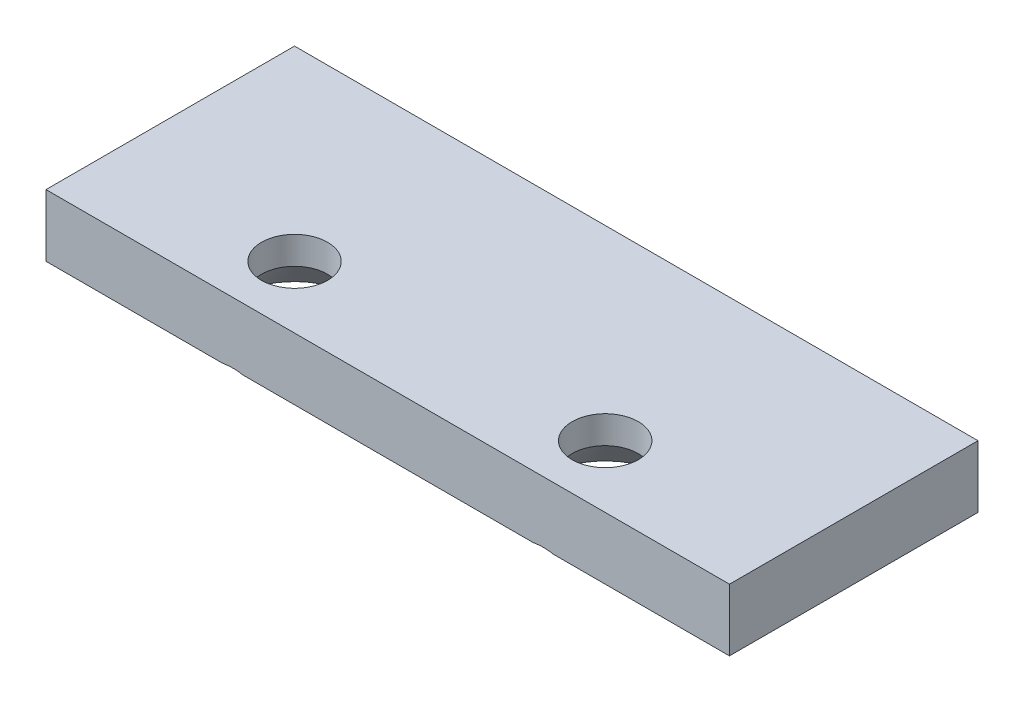
ISO-10303-21;
HEADER;
FILE_DESCRIPTION(('STEP AP214'),'2;1');
FILE_NAME('part.step','',(''),(''),'','','');
FILE_SCHEMA(('AUTOMOTIVE_DESIGN { 1 0 10303 214 1 1 1 1 }'));
ENDSEC;
DATA;
#1=APPLICATION_CONTEXT('core data for automotive mechanical design processes');
#2=APPLICATION_PROTOCOL_DEFINITION('international standard','automotive_design',2000,#1);
#3=PRODUCT_CONTEXT('',#1,'mechanical');
#4=PRODUCT('Part','Part','',(#3));
#5=PRODUCT_RELATED_PRODUCT_CATEGORY('part','',(#4));
#6=PRODUCT_DEFINITION_FORMATION('','',#4);
#7=PRODUCT_DEFINITION_CONTEXT('part definition',#1,'design');
#8=PRODUCT_DEFINITION('design','',#6,#7);
#9=PRODUCT_DEFINITION_SHAPE('','',#8);
#10=(LENGTH_UNIT() NAMED_UNIT(*) SI_UNIT(.MILLI.,.METRE.));
#11=(NAMED_UNIT(*) PLANE_ANGLE_UNIT() SI_UNIT($,.RADIAN.));
#12=(NAMED_UNIT(*) SI_UNIT($,.STERADIAN.) SOLID_ANGLE_UNIT());
#13=UNCERTAINTY_MEASURE_WITH_UNIT(LENGTH_MEASURE(1.E-05),#10,'distance_accuracy_value','');
#14=(GEOMETRIC_REPRESENTATION_CONTEXT(3) GLOBAL_UNCERTAINTY_ASSIGNED_CONTEXT((#13)) GLOBAL_UNIT_ASSIGNED_CONTEXT((#10,
#11,#12)) REPRESENTATION_CONTEXT('',''));
#15=CARTESIAN_POINT('',(0.,0.,0.));
#16=DIRECTION('',(0.,0.,1.));
#17=DIRECTION('',(1.,0.,0.));
#18=AXIS2_PLACEMENT_3D('',#15,#16,#17);
#19=CARTESIAN_POINT('',(-34.925,6.35,12.7));
#20=DIRECTION('',(1.,0.,0.));
#21=DIRECTION('',(0.,0.,-1.));
#22=AXIS2_PLACEMENT_3D('',#19,#20,#21);
#23=PLANE('',#22);
#24=DIRECTION('',(0.,0.,1.));
#25=VECTOR('',#24,1.);
#26=CARTESIAN_POINT('',(-34.925,0.,12.7));
#27=LINE('',#26,#25);
#28=CARTESIAN_POINT('',(-34.925,0.,-12.7));
#29=VERTEX_POINT('',#28);
#30=CARTESIAN_POINT('',(-34.925,0.,12.7));
#31=VERTEX_POINT('',#30);
#32=EDGE_CURVE('E109',#29,#31,#27,.T.);
#33=ORIENTED_EDGE('',*,*,#32,.T.);
#34=DIRECTION('',(0.,-1.,0.));
#35=VECTOR('',#34,1.);
#36=CARTESIAN_POINT('',(-34.925,6.35,12.7));
#37=LINE('',#36,#35);
#38=CARTESIAN_POINT('',(-34.925,6.35,12.7));
#39=VERTEX_POINT('',#38);
#40=EDGE_CURVE('E101',#39,#31,#37,.T.);
#41=ORIENTED_EDGE('',*,*,#40,.F.);
#42=DIRECTION('',(0.,0.,1.));
#43=VECTOR('',#42,1.);
#44=CARTESIAN_POINT('',(-34.925,6.35,12.7));
#45=LINE('',#44,#43);
#46=CARTESIAN_POINT('',(-34.925,6.35,-12.7));
#47=VERTEX_POINT('',#46);
#48=EDGE_CURVE('E127',#47,#39,#45,.T.);
#49=ORIENTED_EDGE('',*,*,#48,.F.);
#50=DIRECTION('',(0.,-1.,0.));
#51=VECTOR('',#50,1.);
#52=CARTESIAN_POINT('',(-34.925,6.35,-12.7));
#53=LINE('',#52,#51);
#54=EDGE_CURVE('E122',#47,#29,#53,.T.);
#55=ORIENTED_EDGE('',*,*,#54,.T.);
#56=EDGE_LOOP('',(#33,#41,#49,#55));
#57=FACE_BOUND('',#56,.T.);
#58=ADVANCED_FACE('F37',(#57),#23,.F.);
#59=CARTESIAN_POINT('',(34.925,6.35,12.7));
#60=DIRECTION('',(0.,0.,-1.));
#61=DIRECTION('',(-1.,0.,0.));
#62=AXIS2_PLACEMENT_3D('',#59,#60,#61);
#63=PLANE('',#62);
#64=DIRECTION('',(1.,0.,0.));
#65=VECTOR('',#64,1.);
#66=CARTESIAN_POINT('',(34.925,0.,12.7));
#67=LINE('',#66,#65);
#68=CARTESIAN_POINT('',(-16.9412707020265,0.,12.7));
#69=VERTEX_POINT('',#68);
#70=EDGE_CURVE('E94',#31,#69,#67,.T.);
#71=ORIENTED_EDGE('',*,*,#70,.T.);
#72=CARTESIAN_POINT('',(-27.111711159099,-7.44049863435223,12.7));
#73=CARTESIAN_POINT('',(-26.8900142030467,-7.21849015756914,12.7));
#74=CARTESIAN_POINT('',(-26.667542256843,-6.99724983861966,12.7));
#75=CARTESIAN_POINT('',(-26.2207269361641,-6.55664003875256,12.7));
#76=CARTESIAN_POINT('',(-25.9963834458083,-6.33727067540558,12.7));
#77=CARTESIAN_POINT('',(-25.5450365723273,-5.90028623391908,12.7));
#78=CARTESIAN_POINT('',(-25.3180284331912,-5.68267606083063,12.7));
#79=CARTESIAN_POINT('',(-24.8614402772959,-5.25017717701521,12.7));
#80=CARTESIAN_POINT('',(-24.6318603162047,-5.03528840759609,12.7));
#81=CARTESIAN_POINT('',(-24.1585834499174,-4.59864566538754,12.7));
#82=CARTESIAN_POINT('',(-23.9147361862689,-4.37705430918698,12.7));
#83=CARTESIAN_POINT('',(-23.4229513491406,-3.93846104766862,12.7));
#84=CARTESIAN_POINT('',(-23.1750139052078,-3.72145899749025,12.7));
#85=CARTESIAN_POINT('',(-22.6743363036637,-3.2935084856463,12.7));
#86=CARTESIAN_POINT('',(-22.4216006653825,-3.08255475577563,12.7));
#87=CARTESIAN_POINT('',(-21.9099478404145,-2.66831015855282,12.7));
#88=CARTESIAN_POINT('',(-21.6510314707663,-2.46501828743247,12.7));
#89=CARTESIAN_POINT('',(-21.1281336105893,-2.07065067132555,12.7));
#90=CARTESIAN_POINT('',(-20.8642305724747,-1.87947158899156,12.7));
#91=CARTESIAN_POINT('',(-20.3267950098655,-1.51061572665232,12.7));
#92=CARTESIAN_POINT('',(-20.0532564530896,-1.33294763314932,12.7));
#93=CARTESIAN_POINT('',(-19.4979277874575,-0.998671846402113,12.7));
#94=CARTESIAN_POINT('',(-19.2162756671132,-0.841837488695917,12.7));
#95=CARTESIAN_POINT('',(-18.6399434588664,-0.554590736614646,12.7));
#96=CARTESIAN_POINT('',(-18.3452854921684,-0.424135436114884,12.7));
#97=CARTESIAN_POINT('',(-17.9091312765299,-0.261975026432636,12.7));
#98=CARTESIAN_POINT('',(-17.7730720715034,-0.215562431120273,12.7));
#99=CARTESIAN_POINT('',(-17.4980518013536,-0.131027700414646,12.7));
#100=CARTESIAN_POINT('',(-17.3590850359654,-0.0929239354218711,12.7));
#101=CARTESIAN_POINT('',(-17.0568664073289,-0.0209405147070558,12.7));
#102=CARTESIAN_POINT('',(-16.8932267496986,0.0113370924355014,12.7));
#103=CARTESIAN_POINT('',(-16.5637336781002,0.0618266854283404,12.7));
#104=CARTESIAN_POINT('',(-16.3978798452994,0.0800359706426331,12.7));
#105=CARTESIAN_POINT('',(-16.0653735476739,0.101477227280589,12.7));
#106=CARTESIAN_POINT('',(-15.8987221462168,0.10472544834034,12.7));
#107=CARTESIAN_POINT('',(-15.5658233357721,0.0961200895994084,12.7));
#108=CARTESIAN_POINT('',(-15.3995759050899,0.0842673395670311,12.7));
#109=CARTESIAN_POINT('',(-15.0748548445024,0.0467641863422717,12.7));
#110=CARTESIAN_POINT('',(-14.916319837432,0.0216361356834019,12.7));
#111=CARTESIAN_POINT('',(-14.6017089591697,-0.0410063196867702,12.7));
#112=CARTESIAN_POINT('',(-14.4456336173354,-0.0785233535626004,12.7));
#113=CARTESIAN_POINT('',(-14.1363392905226,-0.164631083168575,12.7));
#114=CARTESIAN_POINT('',(-13.9831250963599,-0.213238815180769,12.7));
#115=CARTESIAN_POINT('',(-13.6801001299831,-0.320019125711713,12.7));
#116=CARTESIAN_POINT('',(-13.5302893658392,-0.37819172690762,12.7));
#117=CARTESIAN_POINT('',(-13.1875973384899,-0.522244538227997,12.7));
#118=CARTESIAN_POINT('',(-12.9959658390032,-0.611088805258832,12.7));
#119=CARTESIAN_POINT('',(-12.618318713848,-0.80007153651343,12.7));
#120=CARTESIAN_POINT('',(-12.4323056593269,-0.900215075206602,12.7));
#121=CARTESIAN_POINT('',(-12.0651152498202,-1.10968022612794,12.7));
#122=CARTESIAN_POINT('',(-11.8839471168858,-1.2190178983654,12.7));
#123=CARTESIAN_POINT('',(-11.5262247908719,-1.44490121428826,12.7));
#124=CARTESIAN_POINT('',(-11.3496699589198,-1.56144585231093,12.7));
#125=CARTESIAN_POINT('',(-10.997905138297,-1.80218428187398,12.7));
#126=CARTESIAN_POINT('',(-10.8227566771904,-1.92646759393923,12.7));
#127=CARTESIAN_POINT('',(-10.4760337242394,-2.17991598471892,12.7));
#128=CARTESIAN_POINT('',(-10.304459335972,-2.30908120460725,12.7));
#129=CARTESIAN_POINT('',(-9.96459171966463,-2.57127332720709,12.7));
#130=CARTESIAN_POINT('',(-9.79629514162397,-2.70429589943371,12.7));
#131=CARTESIAN_POINT('',(-9.4623879899918,-2.97364896321768,12.7));
#132=CARTESIAN_POINT('',(-9.29677730775431,-3.10997932041366,12.7));
#133=CARTESIAN_POINT('',(-8.94015407600521,-3.40863273587736,12.7));
#134=CARTESIAN_POINT('',(-8.74956656872407,-3.57146274092239,12.7));
#135=CARTESIAN_POINT('',(-8.37109782157845,-3.90024183582537,12.7));
#136=CARTESIAN_POINT('',(-8.18321666829348,-4.06619102508005,12.7));
#137=CARTESIAN_POINT('',(-7.62298876799083,-4.56794678192277,12.7));
#138=CARTESIAN_POINT('',(-7.25410562095834,-4.90762084472864,12.7));
#139=CARTESIAN_POINT('',(-6.52305798089858,-5.59444785671161,12.7));
#140=CARTESIAN_POINT('',(-6.16089701199624,-5.94160453344515,12.7));
#141=CARTESIAN_POINT('',(-5.44185225919591,-6.64135169863482,12.7));
#142=CARTESIAN_POINT('',(-5.08496863205281,-6.99394234786553,12.7));
#143=CARTESIAN_POINT('',(-4.3744576990577,-7.7041110244233,12.7));
#144=CARTESIAN_POINT('',(-4.02084051334287,-8.06169915437269,12.7));
#145=CARTESIAN_POINT('',(-3.3168920486213,-8.78010159743336,12.7));
#146=CARTESIAN_POINT('',(-2.96656081925208,-9.14091595911966,12.7));
#147=CARTESIAN_POINT('',(-2.2686639778744,-9.86498300824657,12.7));
#148=CARTESIAN_POINT('',(-1.92109751263969,-10.2282348741647,12.7));
#149=CARTESIAN_POINT('',(-1.22813480068459,-10.9568025583946,12.7));
#150=CARTESIAN_POINT('',(-0.882738559023617,-11.3221183815143,12.7));
#151=CARTESIAN_POINT('',(0.0664115082121358,-12.3309278995566,12.7));
#152=CARTESIAN_POINT('',(0.668306038715346,-12.9761706016912,12.7));
#153=CARTESIAN_POINT('',(1.86810653847956,-14.2704584029878,12.7));
#154=CARTESIAN_POINT('',(2.46601213121589,-14.9195038505358,12.7));
#155=CARTESIAN_POINT('',(3.65608879149469,-16.2175031467252,12.7));
#156=CARTESIAN_POINT('',(4.24827354443011,-16.8664444544406,12.7));
#157=CARTESIAN_POINT('',(5.13474399088668,-17.841432450539,12.7));
#158=CARTESIAN_POINT('',(5.42991695109481,-18.1666733120116,12.7));
#159=CARTESIAN_POINT('',(6.01973399384551,-18.8176335386324,12.7));
#160=CARTESIAN_POINT('',(6.31437807703817,-19.1433529031916,12.7));
#161=CARTESIAN_POINT('',(6.60878931525675,-19.4692826405457,12.7));
#162=B_SPLINE_CURVE_WITH_KNOTS('',3,(#72,#73,#74,#75,#76,#77,#78,#79,#80,#81,#82,#83,#84,#85,
#86,#87,#88,#89,#90,#91,#92,#93,#94,#95,#96,#97,#98,#99,#100,#101,#102,#103,#104,#105,#106,#107,
#108,#109,#110,#111,#112,#113,#114,#115,#116,#117,#118,#119,#120,#121,#122,#123,#124,#125,#126,
#127,#128,#129,#130,#131,#132,#133,#134,#135,#136,#137,#138,#139,#140,#141,#142,#143,#144,#145,
#146,#147,#148,#149,#150,#151,#152,#153,#154,#155,#156,#157,#158,#159,#160,#161),.UNSPECIFIED.,
.F.,.F.,(4,2,2,2,2,2,2,2,2,2,2,2,2,2,2,2,2,2,2,2,2,2,2,2,2,2,2,2,2,2,2,2,2,2,2,2,2,2,2,2,2,2,2,
2,4),(0.,0.941245744285922,1.88255020688062,2.82591995557513,3.7692693239744,4.75769608842904,
5.74609160667267,6.73359831121374,7.72097519111919,8.69829509612916,9.67623811994311,
10.642473541443,11.6071244887742,12.038175976081,12.47017104461,12.9699798310953,
13.4698845399265,13.9692461598396,14.4685803420089,14.9495884724645,15.4306987471472,
15.9125530848653,16.3944085650186,17.0275964945746,17.6610699273763,18.2956738393515,
18.9301893974099,19.5743774204067,20.218584086159,20.8620935760579,21.5055769703847,
22.2575549291157,23.0095568913311,24.5137496198099,26.0187098395435,27.5237146722482,
29.0324067535716,30.5411215885474,32.0493511986965,33.5575843236528,36.204732722755,
38.852127553711,41.4876969415008,42.8053376883404,44.1229768144943),.UNSPECIFIED.);
#163=CARTESIAN_POINT('',(-14.8087292979735,0.,12.7));
#164=VERTEX_POINT('',#163);
#165=EDGE_CURVE('E11',#69,#164,#162,.T.);
#166=ORIENTED_EDGE('',*,*,#165,.T.);
#167=CARTESIAN_POINT('',(14.8087292979735,0.,12.7));
#168=VERTEX_POINT('',#167);
#169=EDGE_CURVE('E96',#164,#168,#67,.T.);
#170=ORIENTED_EDGE('',*,*,#169,.T.);
#171=CARTESIAN_POINT('',(4.63828884384023,-7.44049863140851,12.7));
#172=CARTESIAN_POINT('',(4.85998579981093,-7.21849015472123,12.7));
#173=CARTESIAN_POINT('',(5.08245774593284,-6.99724983586752,12.7));
#174=CARTESIAN_POINT('',(5.52927306644791,-6.55664003619175,12.7));
#175=CARTESIAN_POINT('',(5.75361655672173,-6.33727067294033,12.7));
#176=CARTESIAN_POINT('',(6.20496343003784,-5.900286231645,12.7));
#177=CARTESIAN_POINT('',(6.43197156909109,-5.68267605865213,12.7));
#178=CARTESIAN_POINT('',(6.88855972482015,-5.25017717502742,12.7));
#179=CARTESIAN_POINT('',(7.1181396858279,-5.03528840570343,12.7));
#180=CARTESIAN_POINT('',(7.59141655193917,-4.59864566369289,12.7));
#181=CARTESIAN_POINT('',(7.83526381549504,-4.37705430759512,12.7));
#182=CARTESIAN_POINT('',(8.32704865243634,-3.93846104628099,12.7));
#183=CARTESIAN_POINT('',(8.57498609627496,-3.72145899620405,12.7));
#184=CARTESIAN_POINT('',(9.0756636976284,-3.29350848456073,12.7));
#185=CARTESIAN_POINT('',(9.32839933581334,-3.08255475478924,12.7));
#186=CARTESIAN_POINT('',(9.84005216058538,-2.66831015776151,12.7));
#187=CARTESIAN_POINT('',(10.0989685301341,-2.46501828673705,12.7));
#188=CARTESIAN_POINT('',(10.6218663901659,-2.07065067077216,12.7));
#189=CARTESIAN_POINT('',(10.8857694282366,-1.87947158848658,12.7));
#190=CARTESIAN_POINT('',(11.4232049907559,-1.51061572624259,12.7));
#191=CARTESIAN_POINT('',(11.6967435474858,-1.33294763278643,12.7));
#192=CARTESIAN_POINT('',(12.252072213024,-0.998671846128622,12.7));
#193=CARTESIAN_POINT('',(12.5337243333204,-0.841837488465082,12.7));
#194=CARTESIAN_POINT('',(13.1100565414673,-0.554590736462974,12.7));
#195=CARTESIAN_POINT('',(13.4047145081131,-0.42413543599974,12.7));
#196=CARTESIAN_POINT('',(13.8408687236816,-0.261975026358643,12.7));
#197=CARTESIAN_POINT('',(13.9769279286928,-0.215562431055932,12.7));
#198=CARTESIAN_POINT('',(14.2519481988111,-0.131027700368046,12.7));
#199=CARTESIAN_POINT('',(14.3909149641831,-0.0929239353833549,12.7));
#200=CARTESIAN_POINT('',(14.6931335927669,-0.0209405146878482,12.7));
#201=CARTESIAN_POINT('',(14.8567732503603,0.0113370924451531,12.7));
#202=CARTESIAN_POINT('',(15.1862663218838,0.0618266854252642,12.7));
#203=CARTESIAN_POINT('',(15.3521201546465,0.0800359706363868,12.7));
#204=CARTESIAN_POINT('',(15.6846264521958,0.101477227274954,12.7));
#205=CARTESIAN_POINT('',(15.8512778536147,0.104725448338482,12.7));
#206=CARTESIAN_POINT('',(16.1841766639838,0.0961200896119414,12.7));
#207=CARTESIAN_POINT('',(16.3504240946285,0.084267339590175,12.7));
#208=CARTESIAN_POINT('',(16.6751451552072,0.046764186384861,12.7));
#209=CARTESIAN_POINT('',(16.8336801623055,0.0216361357292827,12.7));
#210=CARTESIAN_POINT('',(17.1482910406231,-0.0410063196391174,12.7));
#211=CARTESIAN_POINT('',(17.3043663824849,-0.0785233535164712,12.7));
#212=CARTESIAN_POINT('',(17.6136607093521,-0.164631083129774,12.7));
#213=CARTESIAN_POINT('',(17.7668749035417,-0.213238815147805,12.7));
#214=CARTESIAN_POINT('',(18.0698998699712,-0.32001912569391,12.7));
#215=CARTESIAN_POINT('',(18.2197106341409,-0.37819172689914,12.7));
#216=CARTESIAN_POINT('',(18.5624026615151,-0.522244538230218,12.7));
#217=CARTESIAN_POINT('',(18.7540341610014,-0.611088805261008,12.7));
#218=CARTESIAN_POINT('',(19.1316812861558,-0.800071536515461,12.7));
#219=CARTESIAN_POINT('',(19.3176943406766,-0.900215075208532,12.7));
#220=CARTESIAN_POINT('',(19.6848847501826,-1.10968022612962,12.7));
#221=CARTESIAN_POINT('',(19.8660528831167,-1.21901789836692,12.7));
#222=CARTESIAN_POINT('',(20.2237752091299,-1.44490121428944,12.7));
#223=CARTESIAN_POINT('',(20.4003300410817,-1.56144585231192,12.7));
#224=CARTESIAN_POINT('',(20.7520948617037,-1.80218428187444,12.7));
#225=CARTESIAN_POINT('',(20.9272433228097,-1.92646759393933,12.7));
#226=CARTESIAN_POINT('',(21.2739662757597,-2.17991598471829,12.7));
#227=CARTESIAN_POINT('',(21.4455406640266,-2.30908120460625,12.7));
#228=CARTESIAN_POINT('',(21.7854082803331,-2.57127332720532,12.7));
#229=CARTESIAN_POINT('',(21.9537048583733,-2.70429589943155,12.7));
#230=CARTESIAN_POINT('',(22.2876120100046,-2.97364896321472,12.7));
#231=CARTESIAN_POINT('',(22.4532226922416,-3.10997932041029,12.7));
#232=CARTESIAN_POINT('',(22.8098459239903,-3.40863273587356,12.7));
#233=CARTESIAN_POINT('',(23.0004334312715,-3.57146274091856,12.7));
#234=CARTESIAN_POINT('',(23.3789021784172,-3.90024183582151,12.7));
#235=CARTESIAN_POINT('',(23.5667833317022,-4.06619102507619,12.7));
#236=CARTESIAN_POINT('',(24.1270112320049,-4.56794678191887,12.7));
#237=CARTESIAN_POINT('',(24.4958943790374,-4.90762084472472,12.7));
#238=CARTESIAN_POINT('',(25.2269420190973,-5.59444785670766,12.7));
#239=CARTESIAN_POINT('',(25.5891029879997,-5.9416045334412,12.7));
#240=CARTESIAN_POINT('',(26.3081477408001,-6.64135169863086,12.7));
#241=CARTESIAN_POINT('',(26.6650313679432,-6.99394234786158,12.7));
#242=CARTESIAN_POINT('',(27.3755423009384,-7.70411102441935,12.7));
#243=CARTESIAN_POINT('',(27.7291594866532,-8.06169915436874,12.7));
#244=CARTESIAN_POINT('',(28.4331079513749,-8.78010159742942,12.7));
#245=CARTESIAN_POINT('',(28.7834391807441,-9.14091595911572,12.7));
#246=CARTESIAN_POINT('',(29.4813360221218,-9.86498300824265,12.7));
#247=CARTESIAN_POINT('',(29.8289024873566,-10.2282348741607,12.7));
#248=CARTESIAN_POINT('',(30.5218651993117,-10.9568025583907,12.7));
#249=CARTESIAN_POINT('',(30.8672614409727,-11.3221183815104,12.7));
#250=CARTESIAN_POINT('',(31.8164115082091,-12.3309278995534,12.7));
#251=CARTESIAN_POINT('',(32.4183060387129,-12.9761706016886,12.7));
#252=CARTESIAN_POINT('',(33.6181065384784,-14.2704584029866,12.7));
#253=CARTESIAN_POINT('',(34.2160121312153,-14.9195038505352,12.7));
#254=CARTESIAN_POINT('',(35.4060887914953,-16.217503146726,12.7));
#255=CARTESIAN_POINT('',(35.9982735444314,-16.8664444544419,12.7));
#256=CARTESIAN_POINT('',(36.8847439908888,-17.8414324505414,12.7));
#257=CARTESIAN_POINT('',(37.1799169510973,-18.1666733120143,12.7));
#258=CARTESIAN_POINT('',(37.7697339938486,-18.8176335386358,12.7));
#259=CARTESIAN_POINT('',(38.0643780770415,-19.1433529031953,12.7));
#260=CARTESIAN_POINT('',(38.3587893152604,-19.4692826405497,12.7));
#261=B_SPLINE_CURVE_WITH_KNOTS('',3,(#171,#172,#173,#174,#175,#176,#177,#178,#179,#180,#181,
#182,#183,#184,#185,#186,#187,#188,#189,#190,#191,#192,#193,#194,#195,#196,#197,#198,#199,#200,
#201,#202,#203,#204,#205,#206,#207,#208,#209,#210,#211,#212,#213,#214,#215,#216,#217,#218,#219,
#220,#221,#222,#223,#224,#225,#226,#227,#228,#229,#230,#231,#232,#233,#234,#235,#236,#237,#238,
#239,#240,#241,#242,#243,#244,#245,#246,#247,#248,#249,#250,#251,#252,#253,#254,#255,#256,#257,
#258,#259,#260),.UNSPECIFIED.,.F.,.F.,(4,2,2,2,2,2,2,2,2,2,2,2,2,2,2,2,2,2,2,2,2,2,2,2,2,2,2,2,
2,2,2,2,2,2,2,2,2,2,2,2,2,2,2,2,4),(0.,0.941245743909448,1.88255020612764,2.82591995444439,
3.7692693224659,4.75769608650736,5.74609160433784,6.7335983084664,7.72097518795947,
8.6982950927776,9.67623811639934,10.6424735377118,11.6071244848563,12.0381759721103,
12.4701710405862,12.9699798269575,13.4698845356747,13.969246155474,14.4685803375295,
14.9495884680659,15.4306987428295,15.9125530806296,16.394408560865,17.02759649042,
17.6610699232206,18.2956738351947,18.930189393252,19.5743774162469,20.2185840819974,
20.8620935718945,21.5055769662194,22.2575549249505,23.009556887166,24.5137496156448,
26.0187098353784,27.5237146680833,29.0324067494067,30.5411215843826,32.0493511945317,
33.5575843194882,36.204732718593,38.8521275495518,41.4876969373442,42.8053376841852,
44.1229768103404),.UNSPECIFIED.);
#262=CARTESIAN_POINT('',(16.9412707020265,0.,12.7));
#263=VERTEX_POINT('',#262);
#264=EDGE_CURVE('E45',#168,#263,#261,.T.);
#265=ORIENTED_EDGE('',*,*,#264,.T.);
#266=CARTESIAN_POINT('',(34.925,0.,12.7));
#267=VERTEX_POINT('',#266);
#268=EDGE_CURVE('E105',#263,#267,#67,.T.);
#269=ORIENTED_EDGE('',*,*,#268,.T.);
#270=DIRECTION('',(0.,-1.,0.));
#271=VECTOR('',#270,1.);
#272=CARTESIAN_POINT('',(34.925,6.35,12.7));
#273=LINE('',#272,#271);
#274=CARTESIAN_POINT('',(34.925,6.35,12.7));
#275=VERTEX_POINT('',#274);
#276=EDGE_CURVE('E151',#275,#267,#273,.T.);
#277=ORIENTED_EDGE('',*,*,#276,.F.);
#278=DIRECTION('',(1.,0.,0.));
#279=VECTOR('',#278,1.);
#280=CARTESIAN_POINT('',(34.925,6.35,12.7));
#281=LINE('',#280,#279);
#282=EDGE_CURVE('E125',#39,#275,#281,.T.);
#283=ORIENTED_EDGE('',*,*,#282,.F.);
#284=ORIENTED_EDGE('',*,*,#40,.T.);
#285=EDGE_LOOP('',(#71,#166,#170,#265,#269,#277,#283,#284));
#286=FACE_BOUND('',#285,.T.);
#287=ADVANCED_FACE('F99',(#286),#63,.F.);
#288=CARTESIAN_POINT('',(34.925,6.35,12.7));
#289=DIRECTION('',(-1.,0.,0.));
#290=DIRECTION('',(0.,0.,1.));
#291=AXIS2_PLACEMENT_3D('',#288,#289,#290);
#292=PLANE('',#291);
#293=DIRECTION('',(0.,0.,-1.));
#294=VECTOR('',#293,1.);
#295=CARTESIAN_POINT('',(34.925,0.,12.7));
#296=LINE('',#295,#294);
#297=CARTESIAN_POINT('',(34.925,0.,-12.7));
#298=VERTEX_POINT('',#297);
#299=EDGE_CURVE('E103',#267,#298,#296,.T.);
#300=ORIENTED_EDGE('',*,*,#299,.T.);
#301=DIRECTION('',(0.,-1.,0.));
#302=VECTOR('',#301,1.);
#303=CARTESIAN_POINT('',(34.925,6.35,-12.7));
#304=LINE('',#303,#302);
#305=CARTESIAN_POINT('',(34.925,6.35,-12.7));
#306=VERTEX_POINT('',#305);
#307=EDGE_CURVE('E154',#306,#298,#304,.T.);
#308=ORIENTED_EDGE('',*,*,#307,.F.);
#309=DIRECTION('',(0.,0.,-1.));
#310=VECTOR('',#309,1.);
#311=CARTESIAN_POINT('',(34.925,6.35,12.7));
#312=LINE('',#311,#310);
#313=EDGE_CURVE('E123',#275,#306,#312,.T.);
#314=ORIENTED_EDGE('',*,*,#313,.F.);
#315=ORIENTED_EDGE('',*,*,#276,.T.);
#316=EDGE_LOOP('',(#300,#308,#314,#315));
#317=FACE_BOUND('',#316,.T.);
#318=ADVANCED_FACE('F178',(#317),#292,.F.);
#319=CARTESIAN_POINT('',(34.925,6.35,-12.7));
#320=DIRECTION('',(0.,0.,1.));
#321=DIRECTION('',(1.,0.,0.));
#322=AXIS2_PLACEMENT_3D('',#319,#320,#321);
#323=PLANE('',#322);
#324=DIRECTION('',(-1.,0.,0.));
#325=VECTOR('',#324,1.);
#326=CARTESIAN_POINT('',(34.925,0.,-12.7));
#327=LINE('',#326,#325);
#328=EDGE_CURVE('E106',#298,#29,#327,.T.);
#329=ORIENTED_EDGE('',*,*,#328,.T.);
#330=ORIENTED_EDGE('',*,*,#54,.F.);
#331=DIRECTION('',(-1.,0.,0.));
#332=VECTOR('',#331,1.);
#333=CARTESIAN_POINT('',(34.925,6.35,-12.7));
#334=LINE('',#333,#332);
#335=EDGE_CURVE('E120',#306,#47,#334,.T.);
#336=ORIENTED_EDGE('',*,*,#335,.F.);
#337=ORIENTED_EDGE('',*,*,#307,.T.);
#338=EDGE_LOOP('',(#329,#330,#336,#337));
#339=FACE_BOUND('',#338,.T.);
#340=ADVANCED_FACE('F144',(#339),#323,.F.);
#341=CARTESIAN_POINT('',(0.,6.35,0.));
#342=DIRECTION('',(0.,1.,0.));
#343=DIRECTION('',(0.,0.,1.));
#344=AXIS2_PLACEMENT_3D('',#341,#342,#343);
#345=PLANE('',#344);
#346=CARTESIAN_POINT('',(-15.875,6.35,6.35000000000001));
#347=DIRECTION('',(0.,1.,0.));
#348=DIRECTION('',(0.,0.,1.));
#349=AXIS2_PLACEMENT_3D('',#346,#347,#348);
#350=CIRCLE('',#349,3.3782);
#351=CARTESIAN_POINT('',(-15.875,6.35,9.72820000000001));
#352=VERTEX_POINT('',#351);
#353=EDGE_CURVE('E40',#352,#352,#350,.T.);
#354=ORIENTED_EDGE('',*,*,#353,.F.);
#355=EDGE_LOOP('',(#354));
#356=FACE_BOUND('',#355,.T.);
#357=CARTESIAN_POINT('',(15.875,6.35,6.35000000000001));
#358=DIRECTION('',(0.,1.,0.));
#359=DIRECTION('',(0.,0.,1.));
#360=AXIS2_PLACEMENT_3D('',#357,#358,#359);
#361=CIRCLE('',#360,3.3782);
#362=CARTESIAN_POINT('',(15.875,6.35,9.72820000000001));
#363=VERTEX_POINT('',#362);
#364=EDGE_CURVE('E113',#363,#363,#361,.T.);
#365=ORIENTED_EDGE('',*,*,#364,.F.);
#366=EDGE_LOOP('',(#365));
#367=FACE_BOUND('',#366,.T.);
#368=ORIENTED_EDGE('',*,*,#48,.T.);
#369=ORIENTED_EDGE('',*,*,#282,.T.);
#370=ORIENTED_EDGE('',*,*,#313,.T.);
#371=ORIENTED_EDGE('',*,*,#335,.T.);
#372=EDGE_LOOP('',(#368,#369,#370,#371));
#373=FACE_BOUND('',#372,.T.);
#374=ADVANCED_FACE('F141',(#356,#367,#373),#345,.T.);
#375=CARTESIAN_POINT('',(0.,0.,0.));
#376=DIRECTION('',(0.,1.,0.));
#377=DIRECTION('',(0.,0.,1.));
#378=AXIS2_PLACEMENT_3D('',#375,#376,#377);
#379=PLANE('',#378);
#380=ORIENTED_EDGE('',*,*,#169,.F.);
#381=CARTESIAN_POINT('',(-15.875,0.,6.35000000000001));
#382=DIRECTION('',(0.,-1.,0.));
#383=DIRECTION('',(0.,0.,-1.));
#384=AXIS2_PLACEMENT_3D('',#381,#382,#383);
#385=CIRCLE('',#384,6.4389);
#386=EDGE_CURVE('E51',#69,#164,#385,.T.);
#387=ORIENTED_EDGE('',*,*,#386,.F.);
#388=ORIENTED_EDGE('',*,*,#70,.F.);
#389=ORIENTED_EDGE('',*,*,#32,.F.);
#390=ORIENTED_EDGE('',*,*,#328,.F.);
#391=ORIENTED_EDGE('',*,*,#299,.F.);
#392=ORIENTED_EDGE('',*,*,#268,.F.);
#393=CARTESIAN_POINT('',(15.875,0.,6.35000000000001));
#394=DIRECTION('',(0.,-1.,0.));
#395=DIRECTION('',(0.,0.,-1.));
#396=AXIS2_PLACEMENT_3D('',#393,#394,#395);
#397=CIRCLE('',#396,6.4389);
#398=EDGE_CURVE('E57',#168,#263,#397,.T.);
#399=ORIENTED_EDGE('',*,*,#398,.F.);
#400=EDGE_LOOP('',(#380,#387,#388,#389,#390,#391,#392,#399));
#401=FACE_BOUND('',#400,.T.);
#402=ADVANCED_FACE('F92',(#401),#379,.F.);
#403=CARTESIAN_POINT('',(15.875,0.,6.35000000000001));
#404=DIRECTION('',(0.,-1.,0.));
#405=DIRECTION('',(0.,0.,-1.));
#406=AXIS2_PLACEMENT_3D('',#403,#404,#405);
#407=CONICAL_SURFACE('',#406,6.4389,0.715584993317676);
#408=CARTESIAN_POINT('',(15.875,3.52093258398134,6.35000000000001));
#409=DIRECTION('',(0.,-1.,0.));
#410=DIRECTION('',(0.,0.,-1.));
#411=AXIS2_PLACEMENT_3D('',#408,#409,#410);
#412=CIRCLE('',#411,3.3782);
#413=CARTESIAN_POINT('',(15.875,3.52093258398134,2.97180000000001));
#414=VERTEX_POINT('',#413);
#415=EDGE_CURVE('E117',#414,#414,#412,.T.);
#416=ORIENTED_EDGE('',*,*,#415,.F.);
#417=EDGE_LOOP('',(#416));
#418=FACE_BOUND('',#417,.T.);
#419=ORIENTED_EDGE('',*,*,#398,.T.);
#420=ORIENTED_EDGE('',*,*,#264,.F.);
#421=EDGE_LOOP('',(#419,#420));
#422=FACE_BOUND('',#421,.T.);
#423=ADVANCED_FACE('F164',(#418,#422),#407,.F.);
#424=CARTESIAN_POINT('',(15.875,0.,6.35000000000001));
#425=DIRECTION('',(0.,-1.,0.));
#426=DIRECTION('',(0.,0.,-1.));
#427=AXIS2_PLACEMENT_3D('',#424,#425,#426);
#428=CYLINDRICAL_SURFACE('',#427,3.3782);
#429=ORIENTED_EDGE('',*,*,#364,.T.);
#430=EDGE_LOOP('',(#429));
#431=FACE_BOUND('',#430,.T.);
#432=ORIENTED_EDGE('',*,*,#415,.T.);
#433=EDGE_LOOP('',(#432));
#434=FACE_BOUND('',#433,.T.);
#435=ADVANCED_FACE('F169',(#431,#434),#428,.F.);
#436=CARTESIAN_POINT('',(-15.875,0.,6.35000000000001));
#437=DIRECTION('',(0.,-1.,0.));
#438=DIRECTION('',(0.,0.,-1.));
#439=AXIS2_PLACEMENT_3D('',#436,#437,#438);
#440=CONICAL_SURFACE('',#439,6.4389,0.715584993317676);
#441=CARTESIAN_POINT('',(-15.875,3.52093258398134,6.35000000000001));
#442=DIRECTION('',(0.,-1.,0.));
#443=DIRECTION('',(0.,0.,-1.));
#444=AXIS2_PLACEMENT_3D('',#441,#442,#443);
#445=CIRCLE('',#444,3.3782);
#446=CARTESIAN_POINT('',(-15.875,3.52093258398134,2.97180000000001));
#447=VERTEX_POINT('',#446);
#448=EDGE_CURVE('E97',#447,#447,#445,.T.);
#449=ORIENTED_EDGE('',*,*,#448,.F.);
#450=EDGE_LOOP('',(#449));
#451=FACE_BOUND('',#450,.T.);
#452=ORIENTED_EDGE('',*,*,#386,.T.);
#453=ORIENTED_EDGE('',*,*,#165,.F.);
#454=EDGE_LOOP('',(#452,#453));
#455=FACE_BOUND('',#454,.T.);
#456=ADVANCED_FACE('F87',(#451,#455),#440,.F.);
#457=CARTESIAN_POINT('',(-15.875,0.,6.35000000000001));
#458=DIRECTION('',(0.,-1.,0.));
#459=DIRECTION('',(0.,0.,-1.));
#460=AXIS2_PLACEMENT_3D('',#457,#458,#459);
#461=CYLINDRICAL_SURFACE('',#460,3.3782);
#462=ORIENTED_EDGE('',*,*,#353,.T.);
#463=EDGE_LOOP('',(#462));
#464=FACE_BOUND('',#463,.T.);
#465=ORIENTED_EDGE('',*,*,#448,.T.);
#466=EDGE_LOOP('',(#465));
#467=FACE_BOUND('',#466,.T.);
#468=ADVANCED_FACE('F139',(#464,#467),#461,.F.);
#469=CLOSED_SHELL('',(#58,#287,#318,#340,#374,#402,#423,#435,#456,#468));
#470=MANIFOLD_SOLID_BREP('B2',#469);
#471=ADVANCED_BREP_SHAPE_REPRESENTATION('',(#18,#470),#14);
#472=SHAPE_DEFINITION_REPRESENTATION(#9,#471);
ENDSEC;
END-ISO-10303-21;
